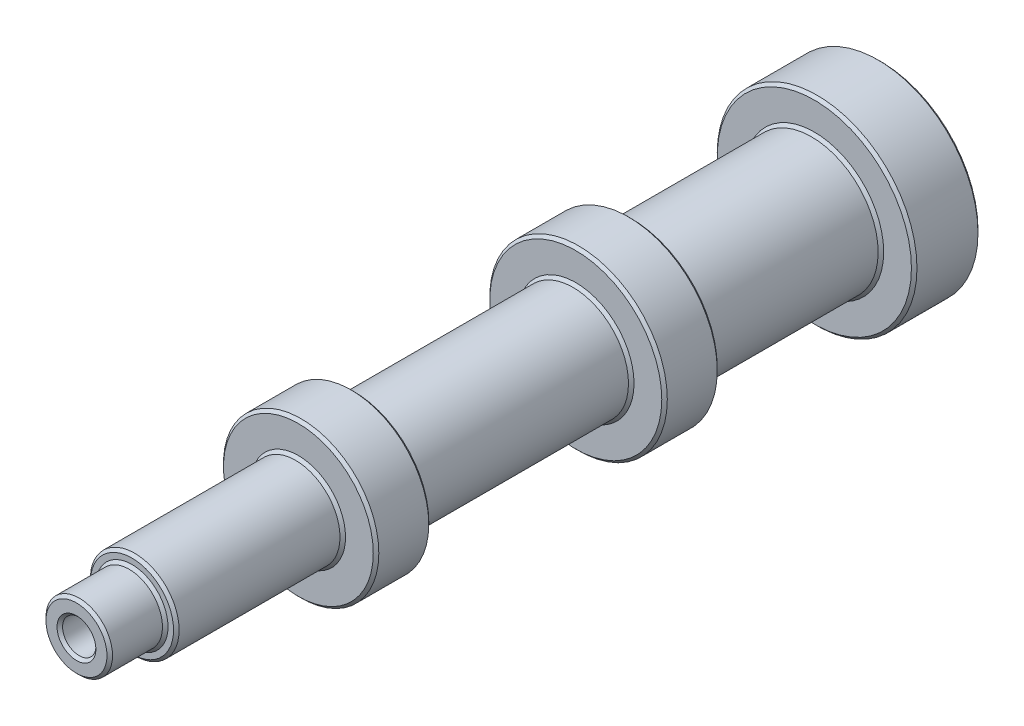
ISO-10303-21;
HEADER;
FILE_DESCRIPTION(('STEP AP214'),'2;1');
FILE_NAME('part.step','',(''),(''),'','','');
FILE_SCHEMA(('AUTOMOTIVE_DESIGN { 1 0 10303 214 1 1 1 1 }'));
ENDSEC;
DATA;
#1=APPLICATION_CONTEXT('core data for automotive mechanical design processes');
#2=APPLICATION_PROTOCOL_DEFINITION('international standard','automotive_design',2000,#1);
#3=PRODUCT_CONTEXT('',#1,'mechanical');
#4=PRODUCT('Part','Part','',(#3));
#5=PRODUCT_RELATED_PRODUCT_CATEGORY('part','',(#4));
#6=PRODUCT_DEFINITION_FORMATION('','',#4);
#7=PRODUCT_DEFINITION_CONTEXT('part definition',#1,'design');
#8=PRODUCT_DEFINITION('design','',#6,#7);
#9=PRODUCT_DEFINITION_SHAPE('','',#8);
#10=(LENGTH_UNIT() NAMED_UNIT(*) SI_UNIT(.MILLI.,.METRE.));
#11=(NAMED_UNIT(*) PLANE_ANGLE_UNIT() SI_UNIT($,.RADIAN.));
#12=(NAMED_UNIT(*) SI_UNIT($,.STERADIAN.) SOLID_ANGLE_UNIT());
#13=UNCERTAINTY_MEASURE_WITH_UNIT(LENGTH_MEASURE(1.E-05),#10,'distance_accuracy_value','');
#14=(GEOMETRIC_REPRESENTATION_CONTEXT(3) GLOBAL_UNCERTAINTY_ASSIGNED_CONTEXT((#13)) GLOBAL_UNIT_ASSIGNED_CONTEXT((#10,
#11,#12)) REPRESENTATION_CONTEXT('',''));
#15=CARTESIAN_POINT('',(0.,0.,0.));
#16=DIRECTION('',(0.,0.,1.));
#17=DIRECTION('',(1.,0.,0.));
#18=AXIS2_PLACEMENT_3D('',#15,#16,#17);
#19=CARTESIAN_POINT('',(0.,0.,95.));
#20=DIRECTION('',(0.,0.,1.));
#21=DIRECTION('',(1.,0.,0.));
#22=AXIS2_PLACEMENT_3D('',#19,#20,#21);
#23=PLANE('',#22);
#24=CARTESIAN_POINT('',(0.,0.,95.));
#25=DIRECTION('',(0.,0.,1.));
#26=DIRECTION('',(1.,0.,0.));
#27=AXIS2_PLACEMENT_3D('',#24,#25,#26);
#28=CIRCLE('',#27,13.5);
#29=CARTESIAN_POINT('',(13.5,0.,95.));
#30=VERTEX_POINT('',#29);
#31=EDGE_CURVE('E27',#30,#30,#28,.T.);
#32=ORIENTED_EDGE('',*,*,#31,.F.);
#33=EDGE_LOOP('',(#32));
#34=FACE_BOUND('',#33,.T.);
#35=CARTESIAN_POINT('',(0.,0.,95.));
#36=DIRECTION('',(0.,0.,1.));
#37=DIRECTION('',(1.,0.,0.));
#38=AXIS2_PLACEMENT_3D('',#35,#36,#37);
#39=CIRCLE('',#38,10.5);
#40=CARTESIAN_POINT('',(10.5,0.,95.));
#41=VERTEX_POINT('',#40);
#42=EDGE_CURVE('E88',#41,#41,#39,.T.);
#43=ORIENTED_EDGE('',*,*,#42,.T.);
#44=EDGE_LOOP('',(#43));
#45=FACE_BOUND('',#44,.T.);
#46=ADVANCED_FACE('F16',(#34,#45),#23,.F.);
#47=CARTESIAN_POINT('',(0.,0.,95.5));
#48=DIRECTION('',(0.,0.,1.));
#49=DIRECTION('',(1.,0.,0.));
#50=AXIS2_PLACEMENT_3D('',#47,#48,#49);
#51=CONICAL_SURFACE('',#50,14.,0.785398163397);
#52=ORIENTED_EDGE('',*,*,#31,.T.);
#53=DIRECTION('',(-0.707106781186548,0.,-0.707106781186548));
#54=VECTOR('',#53,1.);
#55=CARTESIAN_POINT('',(14.,0.,95.5));
#56=LINE('',#55,#54);
#57=CARTESIAN_POINT('',(14.,0.,95.5));
#58=VERTEX_POINT('',#57);
#59=EDGE_CURVE('E10',#58,#30,#56,.T.);
#60=ORIENTED_EDGE('',*,*,#59,.F.);
#61=CARTESIAN_POINT('',(0.,0.,95.5));
#62=DIRECTION('',(0.,0.,1.));
#63=DIRECTION('',(1.,0.,0.));
#64=AXIS2_PLACEMENT_3D('',#61,#62,#63);
#65=CIRCLE('',#64,14.);
#66=EDGE_CURVE('E75',#58,#58,#65,.T.);
#67=ORIENTED_EDGE('',*,*,#66,.F.);
#68=ORIENTED_EDGE('',*,*,#59,.T.);
#69=EDGE_LOOP('',(#52,#60,#67,#68));
#70=FACE_BOUND('',#69,.T.);
#71=ADVANCED_FACE('F18',(#70),#51,.T.);
#72=CARTESIAN_POINT('',(0.,0.,94.5));
#73=DIRECTION('',(0.,0.,1.));
#74=DIRECTION('',(1.,0.,0.));
#75=AXIS2_PLACEMENT_3D('',#72,#73,#74);
#76=CONICAL_SURFACE('',#75,10.,0.785398163397);
#77=DIRECTION('',(0.707106781186548,0.,0.707106781186548));
#78=VECTOR('',#77,1.);
#79=CARTESIAN_POINT('',(10.,0.,94.5));
#80=LINE('',#79,#78);
#81=CARTESIAN_POINT('',(10.,0.,94.5));
#82=VERTEX_POINT('',#81);
#83=EDGE_CURVE('E20',#82,#41,#80,.T.);
#84=ORIENTED_EDGE('',*,*,#83,.F.);
#85=CARTESIAN_POINT('',(0.,0.,94.5));
#86=DIRECTION('',(0.,0.,1.));
#87=DIRECTION('',(1.,0.,0.));
#88=AXIS2_PLACEMENT_3D('',#85,#86,#87);
#89=CIRCLE('',#88,10.);
#90=EDGE_CURVE('E90',#82,#82,#89,.T.);
#91=ORIENTED_EDGE('',*,*,#90,.T.);
#92=ORIENTED_EDGE('',*,*,#83,.T.);
#93=ORIENTED_EDGE('',*,*,#42,.F.);
#94=EDGE_LOOP('',(#84,#91,#92,#93));
#95=FACE_BOUND('',#94,.T.);
#96=ADVANCED_FACE('F453',(#95),#76,.T.);
#97=CARTESIAN_POINT('',(0.,0.,95.));
#98=DIRECTION('',(0.,0.,1.));
#99=DIRECTION('',(1.,0.,0.));
#100=AXIS2_PLACEMENT_3D('',#97,#98,#99);
#101=CYLINDRICAL_SURFACE('',#100,14.);
#102=DIRECTION('',(0.,0.,1.));
#103=VECTOR('',#102,1.);
#104=CARTESIAN_POINT('',(14.,0.,95.));
#105=LINE('',#104,#103);
#106=CARTESIAN_POINT('',(14.,0.,104.5));
#107=VERTEX_POINT('',#106);
#108=EDGE_CURVE('E81',#58,#107,#105,.T.);
#109=ORIENTED_EDGE('',*,*,#108,.F.);
#110=ORIENTED_EDGE('',*,*,#66,.T.);
#111=ORIENTED_EDGE('',*,*,#108,.T.);
#112=CARTESIAN_POINT('',(0.,0.,104.5));
#113=DIRECTION('',(0.,0.,1.));
#114=DIRECTION('',(1.,0.,0.));
#115=AXIS2_PLACEMENT_3D('',#112,#113,#114);
#116=CIRCLE('',#115,14.);
#117=EDGE_CURVE('E168',#107,#107,#116,.T.);
#118=ORIENTED_EDGE('',*,*,#117,.F.);
#119=EDGE_LOOP('',(#109,#110,#111,#118));
#120=FACE_BOUND('',#119,.T.);
#121=ADVANCED_FACE('F79',(#120),#101,.T.);
#122=CARTESIAN_POINT('',(0.,0.,55.));
#123=DIRECTION('',(0.,0.,1.));
#124=DIRECTION('',(1.,0.,0.));
#125=AXIS2_PLACEMENT_3D('',#122,#123,#124);
#126=CYLINDRICAL_SURFACE('',#125,10.);
#127=DIRECTION('',(0.,0.,1.));
#128=VECTOR('',#127,1.);
#129=CARTESIAN_POINT('',(10.,0.,55.));
#130=LINE('',#129,#128);
#131=CARTESIAN_POINT('',(10.,0.,55.5));
#132=VERTEX_POINT('',#131);
#133=EDGE_CURVE('E95',#132,#82,#130,.T.);
#134=ORIENTED_EDGE('',*,*,#133,.F.);
#135=CARTESIAN_POINT('',(0.,0.,55.5));
#136=DIRECTION('',(0.,0.,1.));
#137=DIRECTION('',(1.,0.,0.));
#138=AXIS2_PLACEMENT_3D('',#135,#136,#137);
#139=CIRCLE('',#138,10.);
#140=EDGE_CURVE('E100',#132,#132,#139,.T.);
#141=ORIENTED_EDGE('',*,*,#140,.T.);
#142=ORIENTED_EDGE('',*,*,#133,.T.);
#143=ORIENTED_EDGE('',*,*,#90,.F.);
#144=EDGE_LOOP('',(#134,#141,#142,#143));
#145=FACE_BOUND('',#144,.T.);
#146=ADVANCED_FACE('F462',(#145),#126,.T.);
#147=CARTESIAN_POINT('',(0.,0.,104.5));
#148=DIRECTION('',(0.,0.,-1.));
#149=DIRECTION('',(1.,0.,0.));
#150=AXIS2_PLACEMENT_3D('',#147,#148,#149);
#151=CONICAL_SURFACE('',#150,14.,0.785398163397);
#152=ORIENTED_EDGE('',*,*,#117,.T.);
#153=DIRECTION('',(0.707106781186548,0.,-0.707106781186548));
#154=VECTOR('',#153,1.);
#155=CARTESIAN_POINT('',(14.,0.,104.5));
#156=LINE('',#155,#154);
#157=CARTESIAN_POINT('',(13.5,0.,105.));
#158=VERTEX_POINT('',#157);
#159=EDGE_CURVE('E172',#158,#107,#156,.T.);
#160=ORIENTED_EDGE('',*,*,#159,.F.);
#161=CARTESIAN_POINT('',(0.,0.,105.));
#162=DIRECTION('',(0.,0.,1.));
#163=DIRECTION('',(1.,0.,0.));
#164=AXIS2_PLACEMENT_3D('',#161,#162,#163);
#165=CIRCLE('',#164,13.5);
#166=EDGE_CURVE('E101',#158,#158,#165,.T.);
#167=ORIENTED_EDGE('',*,*,#166,.F.);
#168=ORIENTED_EDGE('',*,*,#159,.T.);
#169=EDGE_LOOP('',(#152,#160,#167,#168));
#170=FACE_BOUND('',#169,.T.);
#171=ADVANCED_FACE('F459',(#170),#151,.T.);
#172=CARTESIAN_POINT('',(0.,0.,55.5));
#173=DIRECTION('',(0.,0.,-1.));
#174=DIRECTION('',(1.,0.,0.));
#175=AXIS2_PLACEMENT_3D('',#172,#173,#174);
#176=CONICAL_SURFACE('',#175,10.,0.785398163397);
#177=DIRECTION('',(-0.707106781186548,0.,0.707106781186548));
#178=VECTOR('',#177,1.);
#179=CARTESIAN_POINT('',(10.,0.,55.5));
#180=LINE('',#179,#178);
#181=CARTESIAN_POINT('',(10.5,0.,55.));
#182=VERTEX_POINT('',#181);
#183=EDGE_CURVE('E96',#182,#132,#180,.T.);
#184=ORIENTED_EDGE('',*,*,#183,.F.);
#185=CARTESIAN_POINT('',(0.,0.,55.));
#186=DIRECTION('',(0.,0.,1.));
#187=DIRECTION('',(1.,0.,0.));
#188=AXIS2_PLACEMENT_3D('',#185,#186,#187);
#189=CIRCLE('',#188,10.5);
#190=EDGE_CURVE('E105',#182,#182,#189,.T.);
#191=ORIENTED_EDGE('',*,*,#190,.T.);
#192=ORIENTED_EDGE('',*,*,#183,.T.);
#193=ORIENTED_EDGE('',*,*,#140,.F.);
#194=EDGE_LOOP('',(#184,#191,#192,#193));
#195=FACE_BOUND('',#194,.T.);
#196=ADVANCED_FACE('F457',(#195),#176,.T.);
#197=CARTESIAN_POINT('',(0.,0.,105.));
#198=DIRECTION('',(0.,0.,1.));
#199=DIRECTION('',(1.,0.,0.));
#200=AXIS2_PLACEMENT_3D('',#197,#198,#199);
#201=PLANE('',#200);
#202=ORIENTED_EDGE('',*,*,#166,.T.);
#203=EDGE_LOOP('',(#202));
#204=FACE_BOUND('',#203,.T.);
#205=CARTESIAN_POINT('',(0.,0.,105.));
#206=DIRECTION('',(0.,0.,1.));
#207=DIRECTION('',(1.,0.,0.));
#208=AXIS2_PLACEMENT_3D('',#205,#206,#207);
#209=CIRCLE('',#208,8.5);
#210=CARTESIAN_POINT('',(8.5,0.,105.));
#211=VERTEX_POINT('',#210);
#212=EDGE_CURVE('E114',#211,#211,#209,.T.);
#213=ORIENTED_EDGE('',*,*,#212,.F.);
#214=EDGE_LOOP('',(#213));
#215=FACE_BOUND('',#214,.T.);
#216=ADVANCED_FACE('F481',(#204,#215),#201,.T.);
#217=CARTESIAN_POINT('',(0.,0.,55.));
#218=DIRECTION('',(0.,0.,1.));
#219=DIRECTION('',(1.,0.,0.));
#220=AXIS2_PLACEMENT_3D('',#217,#218,#219);
#221=PLANE('',#220);
#222=ORIENTED_EDGE('',*,*,#190,.F.);
#223=EDGE_LOOP('',(#222));
#224=FACE_BOUND('',#223,.T.);
#225=CARTESIAN_POINT('',(0.,0.,55.));
#226=DIRECTION('',(0.,0.,1.));
#227=DIRECTION('',(1.,0.,0.));
#228=AXIS2_PLACEMENT_3D('',#225,#226,#227);
#229=CIRCLE('',#228,15.5);
#230=CARTESIAN_POINT('',(15.5,0.,55.));
#231=VERTEX_POINT('',#230);
#232=EDGE_CURVE('E115',#231,#231,#229,.T.);
#233=ORIENTED_EDGE('',*,*,#232,.T.);
#234=EDGE_LOOP('',(#233));
#235=FACE_BOUND('',#234,.T.);
#236=ADVANCED_FACE('F478',(#224,#235),#221,.T.);
#237=CARTESIAN_POINT('',(0.,0.,105.5));
#238=DIRECTION('',(0.,0.,-1.));
#239=DIRECTION('',(1.,0.,0.));
#240=AXIS2_PLACEMENT_3D('',#237,#238,#239);
#241=CONICAL_SURFACE('',#240,8.,0.785398163397);
#242=ORIENTED_EDGE('',*,*,#212,.T.);
#243=DIRECTION('',(0.707106781186548,0.,-0.707106781186548));
#244=VECTOR('',#243,1.);
#245=CARTESIAN_POINT('',(8.,0.,105.5));
#246=LINE('',#245,#244);
#247=CARTESIAN_POINT('',(8.,0.,105.5));
#248=VERTEX_POINT('',#247);
#249=EDGE_CURVE('E109',#248,#211,#246,.T.);
#250=ORIENTED_EDGE('',*,*,#249,.F.);
#251=CARTESIAN_POINT('',(0.,0.,105.5));
#252=DIRECTION('',(0.,0.,1.));
#253=DIRECTION('',(1.,0.,0.));
#254=AXIS2_PLACEMENT_3D('',#251,#252,#253);
#255=CIRCLE('',#254,8.);
#256=EDGE_CURVE('E125',#248,#248,#255,.T.);
#257=ORIENTED_EDGE('',*,*,#256,.F.);
#258=ORIENTED_EDGE('',*,*,#249,.T.);
#259=EDGE_LOOP('',(#242,#250,#257,#258));
#260=FACE_BOUND('',#259,.T.);
#261=ADVANCED_FACE('F366',(#260),#241,.T.);
#262=CARTESIAN_POINT('',(0.,0.,54.5));
#263=DIRECTION('',(0.,0.,-1.));
#264=DIRECTION('',(1.,0.,0.));
#265=AXIS2_PLACEMENT_3D('',#262,#263,#264);
#266=CONICAL_SURFACE('',#265,16.,0.785398163397);
#267=DIRECTION('',(-0.707106781186548,0.,0.707106781186548));
#268=VECTOR('',#267,1.);
#269=CARTESIAN_POINT('',(16.,0.,54.5));
#270=LINE('',#269,#268);
#271=CARTESIAN_POINT('',(16.,0.,54.5));
#272=VERTEX_POINT('',#271);
#273=EDGE_CURVE('E118',#272,#231,#270,.T.);
#274=ORIENTED_EDGE('',*,*,#273,.F.);
#275=CARTESIAN_POINT('',(0.,0.,54.5));
#276=DIRECTION('',(0.,0.,1.));
#277=DIRECTION('',(1.,0.,0.));
#278=AXIS2_PLACEMENT_3D('',#275,#276,#277);
#279=CIRCLE('',#278,16.);
#280=EDGE_CURVE('E133',#272,#272,#279,.T.);
#281=ORIENTED_EDGE('',*,*,#280,.T.);
#282=ORIENTED_EDGE('',*,*,#273,.T.);
#283=ORIENTED_EDGE('',*,*,#232,.F.);
#284=EDGE_LOOP('',(#274,#281,#282,#283));
#285=FACE_BOUND('',#284,.T.);
#286=ADVANCED_FACE('F482',(#285),#266,.T.);
#287=CARTESIAN_POINT('',(0.,0.,105.));
#288=DIRECTION('',(0.,0.,1.));
#289=DIRECTION('',(1.,0.,0.));
#290=AXIS2_PLACEMENT_3D('',#287,#288,#289);
#291=CYLINDRICAL_SURFACE('',#290,8.);
#292=DIRECTION('',(0.,0.,1.));
#293=VECTOR('',#292,1.);
#294=CARTESIAN_POINT('',(8.,0.,105.));
#295=LINE('',#294,#293);
#296=CARTESIAN_POINT('',(8.,0.,134.5));
#297=VERTEX_POINT('',#296);
#298=EDGE_CURVE('E129',#248,#297,#295,.T.);
#299=ORIENTED_EDGE('',*,*,#298,.F.);
#300=ORIENTED_EDGE('',*,*,#256,.T.);
#301=ORIENTED_EDGE('',*,*,#298,.T.);
#302=CARTESIAN_POINT('',(0.,0.,134.5));
#303=DIRECTION('',(0.,0.,1.));
#304=DIRECTION('',(1.,0.,0.));
#305=AXIS2_PLACEMENT_3D('',#302,#303,#304);
#306=CIRCLE('',#305,8.);
#307=EDGE_CURVE('E147',#297,#297,#306,.T.);
#308=ORIENTED_EDGE('',*,*,#307,.F.);
#309=EDGE_LOOP('',(#299,#300,#301,#308));
#310=FACE_BOUND('',#309,.T.);
#311=ADVANCED_FACE('F370',(#310),#291,.T.);
#312=CARTESIAN_POINT('',(0.,0.,45.));
#313=DIRECTION('',(0.,0.,1.));
#314=DIRECTION('',(1.,0.,0.));
#315=AXIS2_PLACEMENT_3D('',#312,#313,#314);
#316=CYLINDRICAL_SURFACE('',#315,16.);
#317=DIRECTION('',(0.,0.,1.));
#318=VECTOR('',#317,1.);
#319=CARTESIAN_POINT('',(16.,0.,45.));
#320=LINE('',#319,#318);
#321=CARTESIAN_POINT('',(16.,0.,45.5));
#322=VERTEX_POINT('',#321);
#323=EDGE_CURVE('E139',#322,#272,#320,.T.);
#324=ORIENTED_EDGE('',*,*,#323,.F.);
#325=CARTESIAN_POINT('',(0.,0.,45.5));
#326=DIRECTION('',(0.,0.,1.));
#327=DIRECTION('',(1.,0.,0.));
#328=AXIS2_PLACEMENT_3D('',#325,#326,#327);
#329=CIRCLE('',#328,16.);
#330=EDGE_CURVE('E151',#322,#322,#329,.T.);
#331=ORIENTED_EDGE('',*,*,#330,.T.);
#332=ORIENTED_EDGE('',*,*,#323,.T.);
#333=ORIENTED_EDGE('',*,*,#280,.F.);
#334=EDGE_LOOP('',(#324,#331,#332,#333));
#335=FACE_BOUND('',#334,.T.);
#336=ADVANCED_FACE('F485',(#335),#316,.T.);
#337=CARTESIAN_POINT('',(0.,0.,134.5));
#338=DIRECTION('',(0.,0.,-1.));
#339=DIRECTION('',(1.,0.,0.));
#340=AXIS2_PLACEMENT_3D('',#337,#338,#339);
#341=CONICAL_SURFACE('',#340,8.,0.785398163397);
#342=ORIENTED_EDGE('',*,*,#307,.T.);
#343=DIRECTION('',(0.707106781186548,0.,-0.707106781186548));
#344=VECTOR('',#343,1.);
#345=CARTESIAN_POINT('',(8.,0.,134.5));
#346=LINE('',#345,#344);
#347=CARTESIAN_POINT('',(7.5,0.,135.));
#348=VERTEX_POINT('',#347);
#349=EDGE_CURVE('E143',#348,#297,#346,.T.);
#350=ORIENTED_EDGE('',*,*,#349,.F.);
#351=CARTESIAN_POINT('',(0.,0.,135.));
#352=DIRECTION('',(0.,0.,1.));
#353=DIRECTION('',(1.,0.,0.));
#354=AXIS2_PLACEMENT_3D('',#351,#352,#353);
#355=CIRCLE('',#354,7.5);
#356=EDGE_CURVE('E159',#348,#348,#355,.T.);
#357=ORIENTED_EDGE('',*,*,#356,.F.);
#358=ORIENTED_EDGE('',*,*,#349,.T.);
#359=EDGE_LOOP('',(#342,#350,#357,#358));
#360=FACE_BOUND('',#359,.T.);
#361=ADVANCED_FACE('F374',(#360),#341,.T.);
#362=CARTESIAN_POINT('',(0.,0.,45.5));
#363=DIRECTION('',(0.,0.,1.));
#364=DIRECTION('',(1.,0.,0.));
#365=AXIS2_PLACEMENT_3D('',#362,#363,#364);
#366=CONICAL_SURFACE('',#365,16.,0.785398163397);
#367=DIRECTION('',(0.707106781186548,0.,0.707106781186548));
#368=VECTOR('',#367,1.);
#369=CARTESIAN_POINT('',(16.,0.,45.5));
#370=LINE('',#369,#368);
#371=CARTESIAN_POINT('',(15.5,0.,45.));
#372=VERTEX_POINT('',#371);
#373=EDGE_CURVE('E155',#372,#322,#370,.T.);
#374=ORIENTED_EDGE('',*,*,#373,.F.);
#375=CARTESIAN_POINT('',(0.,0.,45.));
#376=DIRECTION('',(0.,0.,1.));
#377=DIRECTION('',(1.,0.,0.));
#378=AXIS2_PLACEMENT_3D('',#375,#376,#377);
#379=CIRCLE('',#378,15.5);
#380=EDGE_CURVE('E163',#372,#372,#379,.T.);
#381=ORIENTED_EDGE('',*,*,#380,.T.);
#382=ORIENTED_EDGE('',*,*,#373,.T.);
#383=ORIENTED_EDGE('',*,*,#330,.F.);
#384=EDGE_LOOP('',(#374,#381,#382,#383));
#385=FACE_BOUND('',#384,.T.);
#386=ADVANCED_FACE('F381',(#385),#366,.T.);
#387=CARTESIAN_POINT('',(0.,0.,135.));
#388=DIRECTION('',(0.,0.,1.));
#389=DIRECTION('',(1.,0.,0.));
#390=AXIS2_PLACEMENT_3D('',#387,#388,#389);
#391=PLANE('',#390);
#392=ORIENTED_EDGE('',*,*,#356,.T.);
#393=EDGE_LOOP('',(#392));
#394=FACE_BOUND('',#393,.T.);
#395=CARTESIAN_POINT('',(0.,0.,135.));
#396=DIRECTION('',(0.,0.,1.));
#397=DIRECTION('',(1.,0.,0.));
#398=AXIS2_PLACEMENT_3D('',#395,#396,#397);
#399=CIRCLE('',#398,6.5);
#400=CARTESIAN_POINT('',(6.5,0.,135.));
#401=VERTEX_POINT('',#400);
#402=EDGE_CURVE('E176',#401,#401,#399,.T.);
#403=ORIENTED_EDGE('',*,*,#402,.F.);
#404=EDGE_LOOP('',(#403));
#405=FACE_BOUND('',#404,.T.);
#406=ADVANCED_FACE('F377',(#394,#405),#391,.T.);
#407=CARTESIAN_POINT('',(0.,0.,45.));
#408=DIRECTION('',(0.,0.,1.));
#409=DIRECTION('',(1.,0.,0.));
#410=AXIS2_PLACEMENT_3D('',#407,#408,#409);
#411=PLANE('',#410);
#412=ORIENTED_EDGE('',*,*,#380,.F.);
#413=EDGE_LOOP('',(#412));
#414=FACE_BOUND('',#413,.T.);
#415=CARTESIAN_POINT('',(0.,0.,45.));
#416=DIRECTION('',(0.,0.,1.));
#417=DIRECTION('',(1.,0.,0.));
#418=AXIS2_PLACEMENT_3D('',#415,#416,#417);
#419=CIRCLE('',#418,12.5);
#420=CARTESIAN_POINT('',(12.5,0.,45.));
#421=VERTEX_POINT('',#420);
#422=EDGE_CURVE('E180',#421,#421,#419,.T.);
#423=ORIENTED_EDGE('',*,*,#422,.T.);
#424=EDGE_LOOP('',(#423));
#425=FACE_BOUND('',#424,.T.);
#426=ADVANCED_FACE('F380',(#414,#425),#411,.F.);
#427=CARTESIAN_POINT('',(0.,0.,135.5));
#428=DIRECTION('',(0.,0.,-1.));
#429=DIRECTION('',(1.,0.,0.));
#430=AXIS2_PLACEMENT_3D('',#427,#428,#429);
#431=CONICAL_SURFACE('',#430,6.,0.785398163397);
#432=ORIENTED_EDGE('',*,*,#402,.T.);
#433=DIRECTION('',(0.707106781186548,0.,-0.707106781186548));
#434=VECTOR('',#433,1.);
#435=CARTESIAN_POINT('',(6.,0.,135.5));
#436=LINE('',#435,#434);
#437=CARTESIAN_POINT('',(6.,0.,135.5));
#438=VERTEX_POINT('',#437);
#439=EDGE_CURVE('E167',#438,#401,#436,.T.);
#440=ORIENTED_EDGE('',*,*,#439,.F.);
#441=CARTESIAN_POINT('',(0.,0.,135.5));
#442=DIRECTION('',(0.,0.,1.));
#443=DIRECTION('',(1.,0.,0.));
#444=AXIS2_PLACEMENT_3D('',#441,#442,#443);
#445=CIRCLE('',#444,6.);
#446=EDGE_CURVE('E191',#438,#438,#445,.T.);
#447=ORIENTED_EDGE('',*,*,#446,.F.);
#448=ORIENTED_EDGE('',*,*,#439,.T.);
#449=EDGE_LOOP('',(#432,#440,#447,#448));
#450=FACE_BOUND('',#449,.T.);
#451=ADVANCED_FACE('F385',(#450),#431,.T.);
#452=CARTESIAN_POINT('',(0.,0.,44.5));
#453=DIRECTION('',(0.,0.,1.));
#454=DIRECTION('',(1.,0.,0.));
#455=AXIS2_PLACEMENT_3D('',#452,#453,#454);
#456=CONICAL_SURFACE('',#455,12.,0.785398163397);
#457=DIRECTION('',(0.707106781186548,0.,0.707106781186548));
#458=VECTOR('',#457,1.);
#459=CARTESIAN_POINT('',(12.,0.,44.5));
#460=LINE('',#459,#458);
#461=CARTESIAN_POINT('',(12.,0.,44.5));
#462=VERTEX_POINT('',#461);
#463=EDGE_CURVE('E184',#462,#421,#460,.T.);
#464=ORIENTED_EDGE('',*,*,#463,.F.);
#465=CARTESIAN_POINT('',(0.,0.,44.5));
#466=DIRECTION('',(0.,0.,1.));
#467=DIRECTION('',(1.,0.,0.));
#468=AXIS2_PLACEMENT_3D('',#465,#466,#467);
#469=CIRCLE('',#468,12.);
#470=EDGE_CURVE('E199',#462,#462,#469,.T.);
#471=ORIENTED_EDGE('',*,*,#470,.T.);
#472=ORIENTED_EDGE('',*,*,#463,.T.);
#473=ORIENTED_EDGE('',*,*,#422,.F.);
#474=EDGE_LOOP('',(#464,#471,#472,#473));
#475=FACE_BOUND('',#474,.T.);
#476=ADVANCED_FACE('F495',(#475),#456,.T.);
#477=CARTESIAN_POINT('',(0.,0.,135.));
#478=DIRECTION('',(0.,0.,1.));
#479=DIRECTION('',(1.,0.,0.));
#480=AXIS2_PLACEMENT_3D('',#477,#478,#479);
#481=CYLINDRICAL_SURFACE('',#480,6.);
#482=DIRECTION('',(0.,0.,1.));
#483=VECTOR('',#482,1.);
#484=CARTESIAN_POINT('',(6.,0.,135.));
#485=LINE('',#484,#483);
#486=CARTESIAN_POINT('',(6.,0.,144.5));
#487=VERTEX_POINT('',#486);
#488=EDGE_CURVE('E195',#438,#487,#485,.T.);
#489=ORIENTED_EDGE('',*,*,#488,.F.);
#490=ORIENTED_EDGE('',*,*,#446,.T.);
#491=ORIENTED_EDGE('',*,*,#488,.T.);
#492=CARTESIAN_POINT('',(0.,0.,144.5));
#493=DIRECTION('',(0.,0.,1.));
#494=DIRECTION('',(1.,0.,0.));
#495=AXIS2_PLACEMENT_3D('',#492,#493,#494);
#496=CIRCLE('',#495,6.);
#497=EDGE_CURVE('E214',#487,#487,#496,.T.);
#498=ORIENTED_EDGE('',*,*,#497,.F.);
#499=EDGE_LOOP('',(#489,#490,#491,#498));
#500=FACE_BOUND('',#499,.T.);
#501=ADVANCED_FACE('F390',(#500),#481,.T.);
#502=CARTESIAN_POINT('',(0.,0.,12.));
#503=DIRECTION('',(0.,0.,1.));
#504=DIRECTION('',(1.,0.,0.));
#505=AXIS2_PLACEMENT_3D('',#502,#503,#504);
#506=CYLINDRICAL_SURFACE('',#505,12.);
#507=DIRECTION('',(0.,0.,1.));
#508=VECTOR('',#507,1.);
#509=CARTESIAN_POINT('',(12.,0.,12.));
#510=LINE('',#509,#508);
#511=CARTESIAN_POINT('',(12.,0.,12.5));
#512=VERTEX_POINT('',#511);
#513=EDGE_CURVE('E203',#512,#462,#510,.T.);
#514=ORIENTED_EDGE('',*,*,#513,.F.);
#515=CARTESIAN_POINT('',(0.,0.,12.5));
#516=DIRECTION('',(0.,0.,1.));
#517=DIRECTION('',(1.,0.,0.));
#518=AXIS2_PLACEMENT_3D('',#515,#516,#517);
#519=CIRCLE('',#518,12.);
#520=EDGE_CURVE('E220',#512,#512,#519,.T.);
#521=ORIENTED_EDGE('',*,*,#520,.T.);
#522=ORIENTED_EDGE('',*,*,#513,.T.);
#523=ORIENTED_EDGE('',*,*,#470,.F.);
#524=EDGE_LOOP('',(#514,#521,#522,#523));
#525=FACE_BOUND('',#524,.T.);
#526=ADVANCED_FACE('F498',(#525),#506,.T.);
#527=CARTESIAN_POINT('',(0.,0.,144.5));
#528=DIRECTION('',(0.,0.,-1.));
#529=DIRECTION('',(1.,0.,0.));
#530=AXIS2_PLACEMENT_3D('',#527,#528,#529);
#531=CONICAL_SURFACE('',#530,6.,0.785398163397);
#532=ORIENTED_EDGE('',*,*,#497,.T.);
#533=DIRECTION('',(0.707106781186548,0.,-0.707106781186548));
#534=VECTOR('',#533,1.);
#535=CARTESIAN_POINT('',(6.,0.,144.5));
#536=LINE('',#535,#534);
#537=CARTESIAN_POINT('',(5.5,0.,145.));
#538=VERTEX_POINT('',#537);
#539=EDGE_CURVE('E210',#538,#487,#536,.T.);
#540=ORIENTED_EDGE('',*,*,#539,.F.);
#541=CARTESIAN_POINT('',(0.,0.,145.));
#542=DIRECTION('',(0.,0.,1.));
#543=DIRECTION('',(1.,0.,0.));
#544=AXIS2_PLACEMENT_3D('',#541,#542,#543);
#545=CIRCLE('',#544,5.5);
#546=EDGE_CURVE('E228',#538,#538,#545,.T.);
#547=ORIENTED_EDGE('',*,*,#546,.F.);
#548=ORIENTED_EDGE('',*,*,#539,.T.);
#549=EDGE_LOOP('',(#532,#540,#547,#548));
#550=FACE_BOUND('',#549,.T.);
#551=ADVANCED_FACE('F394',(#550),#531,.T.);
#552=CARTESIAN_POINT('',(0.,0.,12.5));
#553=DIRECTION('',(0.,0.,-1.));
#554=DIRECTION('',(1.,0.,0.));
#555=AXIS2_PLACEMENT_3D('',#552,#553,#554);
#556=CONICAL_SURFACE('',#555,12.,0.785398163397);
#557=DIRECTION('',(-0.707106781186548,0.,0.707106781186548));
#558=VECTOR('',#557,1.);
#559=CARTESIAN_POINT('',(12.,0.,12.5));
#560=LINE('',#559,#558);
#561=CARTESIAN_POINT('',(12.5,0.,12.));
#562=VERTEX_POINT('',#561);
#563=EDGE_CURVE('E224',#562,#512,#560,.T.);
#564=ORIENTED_EDGE('',*,*,#563,.F.);
#565=CARTESIAN_POINT('',(0.,0.,12.));
#566=DIRECTION('',(0.,0.,1.));
#567=DIRECTION('',(1.,0.,0.));
#568=AXIS2_PLACEMENT_3D('',#565,#566,#567);
#569=CIRCLE('',#568,12.5);
#570=EDGE_CURVE('E232',#562,#562,#569,.T.);
#571=ORIENTED_EDGE('',*,*,#570,.T.);
#572=ORIENTED_EDGE('',*,*,#563,.T.);
#573=ORIENTED_EDGE('',*,*,#520,.F.);
#574=EDGE_LOOP('',(#564,#571,#572,#573));
#575=FACE_BOUND('',#574,.T.);
#576=ADVANCED_FACE('F402',(#575),#556,.T.);
#577=CARTESIAN_POINT('',(0.,0.,145.));
#578=DIRECTION('',(0.,0.,1.));
#579=DIRECTION('',(1.,0.,0.));
#580=AXIS2_PLACEMENT_3D('',#577,#578,#579);
#581=PLANE('',#580);
#582=ORIENTED_EDGE('',*,*,#546,.T.);
#583=EDGE_LOOP('',(#582));
#584=FACE_BOUND('',#583,.T.);
#585=CARTESIAN_POINT('',(0.,0.,145.));
#586=DIRECTION('',(0.,0.,-1.));
#587=DIRECTION('',(1.,0.,0.));
#588=AXIS2_PLACEMENT_3D('',#585,#586,#587);
#589=CIRCLE('',#588,3.5);
#590=CARTESIAN_POINT('',(3.5,0.,145.));
#591=VERTEX_POINT('',#590);
#592=EDGE_CURVE('E233',#591,#591,#589,.T.);
#593=ORIENTED_EDGE('',*,*,#592,.T.);
#594=EDGE_LOOP('',(#593));
#595=FACE_BOUND('',#594,.T.);
#596=ADVANCED_FACE('F398',(#584,#595),#581,.T.);
#597=CARTESIAN_POINT('',(0.,0.,12.));
#598=DIRECTION('',(0.,0.,1.));
#599=DIRECTION('',(1.,0.,0.));
#600=AXIS2_PLACEMENT_3D('',#597,#598,#599);
#601=PLANE('',#600);
#602=ORIENTED_EDGE('',*,*,#570,.F.);
#603=EDGE_LOOP('',(#602));
#604=FACE_BOUND('',#603,.T.);
#605=CARTESIAN_POINT('',(0.,0.,12.));
#606=DIRECTION('',(0.,0.,1.));
#607=DIRECTION('',(1.,0.,0.));
#608=AXIS2_PLACEMENT_3D('',#605,#606,#607);
#609=CIRCLE('',#608,17.5);
#610=CARTESIAN_POINT('',(17.5,0.,12.));
#611=VERTEX_POINT('',#610);
#612=EDGE_CURVE('E238',#611,#611,#609,.T.);
#613=ORIENTED_EDGE('',*,*,#612,.T.);
#614=EDGE_LOOP('',(#613));
#615=FACE_BOUND('',#614,.T.);
#616=ADVANCED_FACE('F401',(#604,#615),#601,.T.);
#617=CARTESIAN_POINT('',(0.,0.,144.5));
#618=DIRECTION('',(0.,0.,1.));
#619=DIRECTION('',(1.,0.,0.));
#620=AXIS2_PLACEMENT_3D('',#617,#618,#619);
#621=CONICAL_SURFACE('',#620,3.,0.785398163397);
#622=DIRECTION('',(0.707106781186548,0.,0.707106781186548));
#623=VECTOR('',#622,1.);
#624=CARTESIAN_POINT('',(3.,0.,144.5));
#625=LINE('',#624,#623);
#626=CARTESIAN_POINT('',(3.,0.,144.5));
#627=VERTEX_POINT('',#626);
#628=EDGE_CURVE('E237',#627,#591,#625,.T.);
#629=ORIENTED_EDGE('',*,*,#628,.F.);
#630=CARTESIAN_POINT('',(0.,0.,144.5));
#631=DIRECTION('',(0.,0.,-1.));
#632=DIRECTION('',(1.,0.,0.));
#633=AXIS2_PLACEMENT_3D('',#630,#631,#632);
#634=CIRCLE('',#633,3.);
#635=EDGE_CURVE('E250',#627,#627,#634,.T.);
#636=ORIENTED_EDGE('',*,*,#635,.T.);
#637=ORIENTED_EDGE('',*,*,#628,.T.);
#638=ORIENTED_EDGE('',*,*,#592,.F.);
#639=EDGE_LOOP('',(#629,#636,#637,#638));
#640=FACE_BOUND('',#639,.T.);
#641=ADVANCED_FACE('F406',(#640),#621,.F.);
#642=CARTESIAN_POINT('',(0.,0.,11.5));
#643=DIRECTION('',(0.,0.,-1.));
#644=DIRECTION('',(1.,0.,0.));
#645=AXIS2_PLACEMENT_3D('',#642,#643,#644);
#646=CONICAL_SURFACE('',#645,18.,0.785398163397);
#647=DIRECTION('',(-0.707106781186548,0.,0.707106781186548));
#648=VECTOR('',#647,1.);
#649=CARTESIAN_POINT('',(18.,0.,11.5));
#650=LINE('',#649,#648);
#651=CARTESIAN_POINT('',(18.,0.,11.5));
#652=VERTEX_POINT('',#651);
#653=EDGE_CURVE('E242',#652,#611,#650,.T.);
#654=ORIENTED_EDGE('',*,*,#653,.F.);
#655=CARTESIAN_POINT('',(0.,0.,11.5));
#656=DIRECTION('',(0.,0.,1.));
#657=DIRECTION('',(1.,0.,0.));
#658=AXIS2_PLACEMENT_3D('',#655,#656,#657);
#659=CIRCLE('',#658,18.);
#660=EDGE_CURVE('E251',#652,#652,#659,.T.);
#661=ORIENTED_EDGE('',*,*,#660,.T.);
#662=ORIENTED_EDGE('',*,*,#653,.T.);
#663=ORIENTED_EDGE('',*,*,#612,.F.);
#664=EDGE_LOOP('',(#654,#661,#662,#663));
#665=FACE_BOUND('',#664,.T.);
#666=ADVANCED_FACE('F296',(#665),#646,.T.);
#667=CARTESIAN_POINT('',(0.,0.,0.));
#668=DIRECTION('',(0.,0.,-1.));
#669=DIRECTION('',(1.,0.,0.));
#670=AXIS2_PLACEMENT_3D('',#667,#668,#669);
#671=CYLINDRICAL_SURFACE('',#670,3.);
#672=DIRECTION('',(0.,0.,1.));
#673=VECTOR('',#672,1.);
#674=CARTESIAN_POINT('',(3.,0.,0.));
#675=LINE('',#674,#673);
#676=CARTESIAN_POINT('',(3.,0.,0.5));
#677=VERTEX_POINT('',#676);
#678=EDGE_CURVE('E246',#677,#627,#675,.T.);
#679=ORIENTED_EDGE('',*,*,#678,.F.);
#680=CARTESIAN_POINT('',(0.,0.,0.5));
#681=DIRECTION('',(0.,0.,1.));
#682=DIRECTION('',(1.,0.,0.));
#683=AXIS2_PLACEMENT_3D('',#680,#681,#682);
#684=CIRCLE('',#683,3.);
#685=EDGE_CURVE('E266',#677,#677,#684,.T.);
#686=ORIENTED_EDGE('',*,*,#685,.F.);
#687=ORIENTED_EDGE('',*,*,#678,.T.);
#688=ORIENTED_EDGE('',*,*,#635,.F.);
#689=EDGE_LOOP('',(#679,#686,#687,#688));
#690=FACE_BOUND('',#689,.T.);
#691=ADVANCED_FACE('F409',(#690),#671,.F.);
#692=CARTESIAN_POINT('',(0.,0.,0.));
#693=DIRECTION('',(0.,0.,1.));
#694=DIRECTION('',(1.,0.,0.));
#695=AXIS2_PLACEMENT_3D('',#692,#693,#694);
#696=CYLINDRICAL_SURFACE('',#695,18.);
#697=DIRECTION('',(0.,0.,1.));
#698=VECTOR('',#697,1.);
#699=CARTESIAN_POINT('',(18.,0.,0.));
#700=LINE('',#699,#698);
#701=CARTESIAN_POINT('',(18.,0.,0.5));
#702=VERTEX_POINT('',#701);
#703=EDGE_CURVE('E255',#702,#652,#700,.T.);
#704=ORIENTED_EDGE('',*,*,#703,.F.);
#705=CARTESIAN_POINT('',(0.,0.,0.5));
#706=DIRECTION('',(0.,0.,1.));
#707=DIRECTION('',(1.,0.,0.));
#708=AXIS2_PLACEMENT_3D('',#705,#706,#707);
#709=CIRCLE('',#708,18.);
#710=EDGE_CURVE('E270',#702,#702,#709,.T.);
#711=ORIENTED_EDGE('',*,*,#710,.T.);
#712=ORIENTED_EDGE('',*,*,#703,.T.);
#713=ORIENTED_EDGE('',*,*,#660,.F.);
#714=EDGE_LOOP('',(#704,#711,#712,#713));
#715=FACE_BOUND('',#714,.T.);
#716=ADVANCED_FACE('F435',(#715),#696,.T.);
#717=CARTESIAN_POINT('',(0.,0.,0.5));
#718=DIRECTION('',(0.,0.,-1.));
#719=DIRECTION('',(1.,0.,0.));
#720=AXIS2_PLACEMENT_3D('',#717,#718,#719);
#721=CONICAL_SURFACE('',#720,3.,0.785398163397);
#722=ORIENTED_EDGE('',*,*,#685,.T.);
#723=DIRECTION('',(-0.707106781186548,0.,0.707106781186548));
#724=VECTOR('',#723,1.);
#725=CARTESIAN_POINT('',(3.,0.,0.5));
#726=LINE('',#725,#724);
#727=CARTESIAN_POINT('',(3.5,0.,0.));
#728=VERTEX_POINT('',#727);
#729=EDGE_CURVE('E262',#728,#677,#726,.T.);
#730=ORIENTED_EDGE('',*,*,#729,.F.);
#731=CARTESIAN_POINT('',(0.,0.,0.));
#732=DIRECTION('',(0.,0.,1.));
#733=DIRECTION('',(1.,0.,0.));
#734=AXIS2_PLACEMENT_3D('',#731,#732,#733);
#735=CIRCLE('',#734,3.5);
#736=EDGE_CURVE('E277',#728,#728,#735,.T.);
#737=ORIENTED_EDGE('',*,*,#736,.F.);
#738=ORIENTED_EDGE('',*,*,#729,.T.);
#739=EDGE_LOOP('',(#722,#730,#737,#738));
#740=FACE_BOUND('',#739,.T.);
#741=ADVANCED_FACE('F413',(#740),#721,.F.);
#742=CARTESIAN_POINT('',(0.,0.,0.5));
#743=DIRECTION('',(0.,0.,1.));
#744=DIRECTION('',(1.,0.,0.));
#745=AXIS2_PLACEMENT_3D('',#742,#743,#744);
#746=CONICAL_SURFACE('',#745,18.,0.785398163397);
#747=DIRECTION('',(0.707106781186548,0.,0.707106781186548));
#748=VECTOR('',#747,1.);
#749=CARTESIAN_POINT('',(18.,0.,0.5));
#750=LINE('',#749,#748);
#751=CARTESIAN_POINT('',(17.5,0.,0.));
#752=VERTEX_POINT('',#751);
#753=EDGE_CURVE('E274',#752,#702,#750,.T.);
#754=ORIENTED_EDGE('',*,*,#753,.F.);
#755=CARTESIAN_POINT('',(0.,0.,0.));
#756=DIRECTION('',(0.,0.,1.));
#757=DIRECTION('',(1.,0.,0.));
#758=AXIS2_PLACEMENT_3D('',#755,#756,#757);
#759=CIRCLE('',#758,17.5);
#760=EDGE_CURVE('E282',#752,#752,#759,.T.);
#761=ORIENTED_EDGE('',*,*,#760,.T.);
#762=ORIENTED_EDGE('',*,*,#753,.T.);
#763=ORIENTED_EDGE('',*,*,#710,.F.);
#764=EDGE_LOOP('',(#754,#761,#762,#763));
#765=FACE_BOUND('',#764,.T.);
#766=ADVANCED_FACE('F423',(#765),#746,.T.);
#767=CARTESIAN_POINT('',(0.,0.,0.));
#768=DIRECTION('',(0.,0.,1.));
#769=DIRECTION('',(1.,0.,0.));
#770=AXIS2_PLACEMENT_3D('',#767,#768,#769);
#771=PLANE('',#770);
#772=ORIENTED_EDGE('',*,*,#736,.T.);
#773=EDGE_LOOP('',(#772));
#774=FACE_BOUND('',#773,.T.);
#775=ORIENTED_EDGE('',*,*,#760,.F.);
#776=EDGE_LOOP('',(#775));
#777=FACE_BOUND('',#776,.T.);
#778=ADVANCED_FACE('F420',(#774,#777),#771,.F.);
#779=CLOSED_SHELL('',(#46,#71,#96,#121,#146,#171,#196,#216,#236,#261,#286,#311,#336,#361,#386,
#406,#426,#451,#476,#501,#526,#551,#576,#596,#616,#641,#666,#691,#716,#741,#766,#778));
#780=MANIFOLD_SOLID_BREP('B1',#779);
#781=ADVANCED_BREP_SHAPE_REPRESENTATION('',(#18,#780),#14);
#782=SHAPE_DEFINITION_REPRESENTATION(#9,#781);
ENDSEC;
END-ISO-10303-21;
